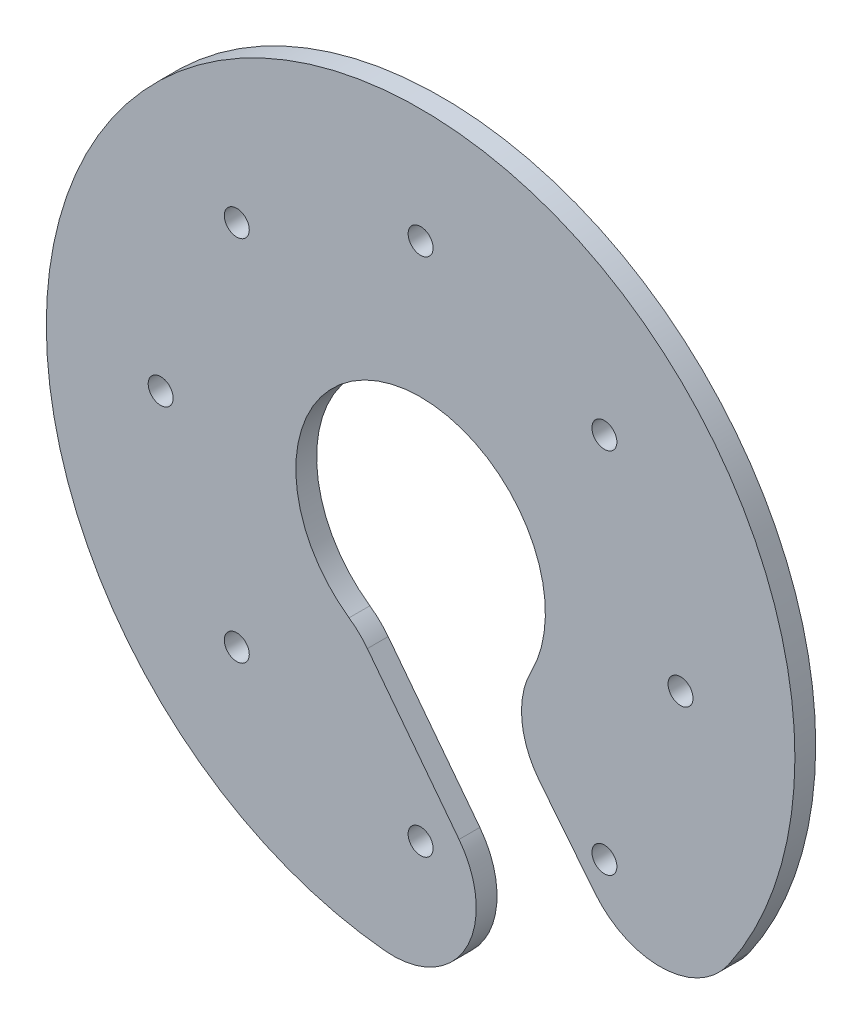
ISO-10303-21;
HEADER;
FILE_DESCRIPTION(('STEP AP214'),'2;1');
FILE_NAME('part.step','',(''),(''),'','','');
FILE_SCHEMA(('AUTOMOTIVE_DESIGN { 1 0 10303 214 1 1 1 1 }'));
ENDSEC;
DATA;
#1=APPLICATION_CONTEXT('core data for automotive mechanical design processes');
#2=APPLICATION_PROTOCOL_DEFINITION('international standard','automotive_design',2000,#1);
#3=PRODUCT_CONTEXT('',#1,'mechanical');
#4=PRODUCT('Part','Part','',(#3));
#5=PRODUCT_RELATED_PRODUCT_CATEGORY('part','',(#4));
#6=PRODUCT_DEFINITION_FORMATION('','',#4);
#7=PRODUCT_DEFINITION_CONTEXT('part definition',#1,'design');
#8=PRODUCT_DEFINITION('design','',#6,#7);
#9=PRODUCT_DEFINITION_SHAPE('','',#8);
#10=(LENGTH_UNIT() NAMED_UNIT(*) SI_UNIT(.MILLI.,.METRE.));
#11=(NAMED_UNIT(*) PLANE_ANGLE_UNIT() SI_UNIT($,.RADIAN.));
#12=(NAMED_UNIT(*) SI_UNIT($,.STERADIAN.) SOLID_ANGLE_UNIT());
#13=UNCERTAINTY_MEASURE_WITH_UNIT(LENGTH_MEASURE(1.E-05),#10,'distance_accuracy_value','');
#14=(GEOMETRIC_REPRESENTATION_CONTEXT(3) GLOBAL_UNCERTAINTY_ASSIGNED_CONTEXT((#13)) GLOBAL_UNIT_ASSIGNED_CONTEXT((#10,
#11,#12)) REPRESENTATION_CONTEXT('',''));
#15=CARTESIAN_POINT('',(0.,0.,0.));
#16=DIRECTION('',(0.,0.,1.));
#17=DIRECTION('',(1.,0.,0.));
#18=AXIS2_PLACEMENT_3D('',#15,#16,#17);
#19=CARTESIAN_POINT('',(0.,0.,5.));
#20=DIRECTION('',(0.,0.,-1.));
#21=DIRECTION('',(-1.,0.,0.));
#22=AXIS2_PLACEMENT_3D('',#19,#20,#21);
#23=CYLINDRICAL_SURFACE('',#22,90.);
#24=CARTESIAN_POINT('',(0.,0.,0.));
#25=DIRECTION('',(0.,0.,1.));
#26=DIRECTION('',(1.,0.,0.));
#27=AXIS2_PLACEMENT_3D('',#24,#25,#26);
#28=CIRCLE('',#27,90.);
#29=CARTESIAN_POINT('',(73.9953490326579,-51.2317120691387,0.));
#30=VERTEX_POINT('',#29);
#31=CARTESIAN_POINT('',(-8.50955709755238,-89.5968048426031,0.));
#32=VERTEX_POINT('',#31);
#33=EDGE_CURVE('E155',#30,#32,#28,.T.);
#34=ORIENTED_EDGE('',*,*,#33,.T.);
#35=DIRECTION('',(0.,0.,-1.));
#36=VECTOR('',#35,1.);
#37=CARTESIAN_POINT('',(-8.50955709755238,-89.5968048426031,5.));
#38=LINE('',#37,#36);
#39=CARTESIAN_POINT('',(-8.50955709755238,-89.5968048426031,5.));
#40=VERTEX_POINT('',#39);
#41=EDGE_CURVE('E147',#32,#40,#38,.F.);
#42=ORIENTED_EDGE('',*,*,#41,.T.);
#43=CARTESIAN_POINT('',(0.,0.,5.));
#44=DIRECTION('',(0.,0.,1.));
#45=DIRECTION('',(1.,0.,0.));
#46=AXIS2_PLACEMENT_3D('',#43,#44,#45);
#47=CIRCLE('',#46,90.);
#48=CARTESIAN_POINT('',(73.9953490326579,-51.2317120691387,5.));
#49=VERTEX_POINT('',#48);
#50=EDGE_CURVE('E120',#49,#40,#47,.T.);
#51=ORIENTED_EDGE('',*,*,#50,.F.);
#52=DIRECTION('',(0.,0.,-1.));
#53=VECTOR('',#52,1.);
#54=CARTESIAN_POINT('',(73.9953490326579,-51.2317120691387,5.));
#55=LINE('',#54,#53);
#56=EDGE_CURVE('E109',#49,#30,#55,.T.);
#57=ORIENTED_EDGE('',*,*,#56,.T.);
#58=EDGE_LOOP('',(#34,#42,#51,#57));
#59=FACE_BOUND('',#58,.T.);
#60=ADVANCED_FACE('F35',(#59),#23,.T.);
#61=CARTESIAN_POINT('',(0.,0.,5.));
#62=DIRECTION('',(0.,0.,1.));
#63=DIRECTION('',(1.,0.,0.));
#64=AXIS2_PLACEMENT_3D('',#61,#62,#63);
#65=PLANE('',#64);
#66=CARTESIAN_POINT('',(44.1941738241591,-44.1941738241593,5.));
#67=DIRECTION('',(0.,0.,1.));
#68=DIRECTION('',(1.,0.,0.));
#69=AXIS2_PLACEMENT_3D('',#66,#67,#68);
#70=CIRCLE('',#69,3.);
#71=CARTESIAN_POINT('',(47.1941738241591,-44.1941738241593,5.));
#72=VERTEX_POINT('',#71);
#73=EDGE_CURVE('E178',#72,#72,#70,.T.);
#74=ORIENTED_EDGE('',*,*,#73,.F.);
#75=EDGE_LOOP('',(#74));
#76=FACE_BOUND('',#75,.T.);
#77=CARTESIAN_POINT('',(-2.18217583677696E-13,-62.5,5.));
#78=DIRECTION('',(0.,0.,1.));
#79=DIRECTION('',(1.,0.,0.));
#80=AXIS2_PLACEMENT_3D('',#77,#78,#79);
#81=CIRCLE('',#80,2.99999999999999);
#82=CARTESIAN_POINT('',(2.99999999999977,-62.5,5.));
#83=VERTEX_POINT('',#82);
#84=EDGE_CURVE('E397',#83,#83,#81,.T.);
#85=ORIENTED_EDGE('',*,*,#84,.F.);
#86=EDGE_LOOP('',(#85));
#87=FACE_BOUND('',#86,.T.);
#88=CARTESIAN_POINT('',(-44.1941738241594,-44.194173824159,5.));
#89=DIRECTION('',(0.,0.,1.));
#90=DIRECTION('',(1.,0.,0.));
#91=AXIS2_PLACEMENT_3D('',#88,#89,#90);
#92=CIRCLE('',#91,2.99999999999999);
#93=CARTESIAN_POINT('',(-41.1941738241594,-44.194173824159,5.));
#94=VERTEX_POINT('',#93);
#95=EDGE_CURVE('E394',#94,#94,#92,.T.);
#96=ORIENTED_EDGE('',*,*,#95,.F.);
#97=EDGE_LOOP('',(#96));
#98=FACE_BOUND('',#97,.T.);
#99=CARTESIAN_POINT('',(-62.5,4.36435167355392E-13,5.));
#100=DIRECTION('',(0.,0.,1.));
#101=DIRECTION('',(1.,0.,0.));
#102=AXIS2_PLACEMENT_3D('',#99,#100,#101);
#103=CIRCLE('',#102,2.99999999999999);
#104=CARTESIAN_POINT('',(-59.5,4.36435167355392E-13,5.));
#105=VERTEX_POINT('',#104);
#106=EDGE_CURVE('E389',#105,#105,#103,.T.);
#107=ORIENTED_EDGE('',*,*,#106,.F.);
#108=EDGE_LOOP('',(#107));
#109=FACE_BOUND('',#108,.T.);
#110=CARTESIAN_POINT('',(-44.1941738241588,44.1941738241596,5.));
#111=DIRECTION('',(0.,0.,1.));
#112=DIRECTION('',(1.,0.,0.));
#113=AXIS2_PLACEMENT_3D('',#110,#111,#112);
#114=CIRCLE('',#113,3.);
#115=CARTESIAN_POINT('',(-41.1941738241588,44.1941738241596,5.));
#116=VERTEX_POINT('',#115);
#117=EDGE_CURVE('E386',#116,#116,#114,.T.);
#118=ORIENTED_EDGE('',*,*,#117,.F.);
#119=EDGE_LOOP('',(#118));
#120=FACE_BOUND('',#119,.T.);
#121=CARTESIAN_POINT('',(6.54652751033088E-13,62.5,5.));
#122=DIRECTION('',(0.,0.,1.));
#123=DIRECTION('',(1.,0.,0.));
#124=AXIS2_PLACEMENT_3D('',#121,#122,#123);
#125=CIRCLE('',#124,2.99999999999999);
#126=CARTESIAN_POINT('',(3.00000000000065,62.5,5.));
#127=VERTEX_POINT('',#126);
#128=EDGE_CURVE('E384',#127,#127,#125,.T.);
#129=ORIENTED_EDGE('',*,*,#128,.F.);
#130=EDGE_LOOP('',(#129));
#131=FACE_BOUND('',#130,.T.);
#132=CARTESIAN_POINT('',(44.1941738241597,44.1941738241587,5.));
#133=DIRECTION('',(0.,0.,1.));
#134=DIRECTION('',(1.,0.,0.));
#135=AXIS2_PLACEMENT_3D('',#132,#133,#134);
#136=CIRCLE('',#135,2.99999999999999);
#137=CARTESIAN_POINT('',(47.1941738241597,44.1941738241587,5.));
#138=VERTEX_POINT('',#137);
#139=EDGE_CURVE('E202',#138,#138,#136,.T.);
#140=ORIENTED_EDGE('',*,*,#139,.F.);
#141=EDGE_LOOP('',(#140));
#142=FACE_BOUND('',#141,.T.);
#143=CARTESIAN_POINT('',(62.5,0.,5.));
#144=DIRECTION('',(0.,0.,1.));
#145=DIRECTION('',(1.,0.,0.));
#146=AXIS2_PLACEMENT_3D('',#143,#144,#145);
#147=CIRCLE('',#146,2.99999999999999);
#148=CARTESIAN_POINT('',(65.5,0.,5.));
#149=VERTEX_POINT('',#148);
#150=EDGE_CURVE('E173',#149,#149,#147,.T.);
#151=ORIENTED_EDGE('',*,*,#150,.F.);
#152=EDGE_LOOP('',(#151));
#153=FACE_BOUND('',#152,.T.);
#154=DIRECTION('',(0.608922434801944,-0.793229770239917,0.));
#155=VECTOR('',#154,1.);
#156=CARTESIAN_POINT('',(-14.9208081048509,-26.0263229346409,5.));
#157=LINE('',#156,#155);
#158=CARTESIAN_POINT('',(-12.7999028265818,-28.789179269749,5.));
#159=VERTEX_POINT('',#158);
#160=CARTESIAN_POINT('',(9.24605099559094,-57.5079550704302,5.));
#161=VERTEX_POINT('',#160);
#162=EDGE_CURVE('E205',#159,#161,#157,.T.);
#163=ORIENTED_EDGE('',*,*,#162,.F.);
#164=CARTESIAN_POINT('',(-28.6644982313802,-40.9676279657878,5.));
#165=DIRECTION('',(0.,0.,1.));
#166=DIRECTION('',(1.,0.,0.));
#167=AXIS2_PLACEMENT_3D('',#164,#165,#166);
#168=CIRCLE('',#167,20.);
#169=CARTESIAN_POINT('',(-17.1986989388281,-24.5805767794727,5.));
#170=VERTEX_POINT('',#169);
#171=EDGE_CURVE('E123',#159,#170,#168,.T.);
#172=ORIENTED_EDGE('',*,*,#171,.T.);
#173=CARTESIAN_POINT('',(0.,0.,5.));
#174=DIRECTION('',(0.,0.,1.));
#175=DIRECTION('',(1.,0.,0.));
#176=AXIS2_PLACEMENT_3D('',#173,#174,#175);
#177=CIRCLE('',#176,30.);
#178=CARTESIAN_POINT('',(26.5567679917836,-13.9548584310475,5.));
#179=VERTEX_POINT('',#178);
#180=EDGE_CURVE('E172',#179,#170,#177,.T.);
#181=ORIENTED_EDGE('',*,*,#180,.F.);
#182=CARTESIAN_POINT('',(44.261279986306,-23.2580973850792,5.));
#183=DIRECTION('',(0.,0.,1.));
#184=DIRECTION('',(1.,0.,0.));
#185=AXIS2_PLACEMENT_3D('',#182,#183,#184);
#186=CIRCLE('',#185,20.);
#187=CARTESIAN_POINT('',(28.6529158454746,-35.763255074897,5.));
#188=VERTEX_POINT('',#187);
#189=EDGE_CURVE('E124',#179,#188,#186,.T.);
#190=ORIENTED_EDGE('',*,*,#189,.T.);
#191=DIRECTION('',(-0.625257884490891,0.780418207041568,0.));
#192=VECTOR('',#191,1.);
#193=CARTESIAN_POINT('',(69.7683284825411,-87.0816269145744,5.));
#194=LINE('',#193,#192);
#195=CARTESIAN_POINT('',(41.9435739956803,-52.3520448547035,5.));
#196=VERTEX_POINT('',#195);
#197=EDGE_CURVE('E162',#196,#188,#194,.T.);
#198=ORIENTED_EDGE('',*,*,#197,.F.);
#199=CARTESIAN_POINT('',(57.5519381365117,-39.8468871648857,5.));
#200=DIRECTION('',(0.,0.,1.));
#201=DIRECTION('',(1.,0.,0.));
#202=AXIS2_PLACEMENT_3D('',#199,#200,#201);
#203=CIRCLE('',#202,20.);
#204=EDGE_CURVE('E126',#196,#49,#203,.T.);
#205=ORIENTED_EDGE('',*,*,#204,.T.);
#206=ORIENTED_EDGE('',*,*,#50,.T.);
#207=CARTESIAN_POINT('',(-6.61854440920741,-69.686403766469,5.));
#208=DIRECTION('',(0.,0.,1.));
#209=DIRECTION('',(1.,0.,0.));
#210=AXIS2_PLACEMENT_3D('',#207,#208,#209);
#211=CIRCLE('',#210,20.);
#212=EDGE_CURVE('E133',#40,#161,#211,.T.);
#213=ORIENTED_EDGE('',*,*,#212,.T.);
#214=EDGE_LOOP('',(#163,#172,#181,#190,#198,#205,#206,#213));
#215=FACE_BOUND('',#214,.T.);
#216=ADVANCED_FACE('F158',(#76,#87,#98,#109,#120,#131,#142,#153,#215),#65,.T.);
#217=CARTESIAN_POINT('',(0.,0.,0.));
#218=DIRECTION('',(0.,0.,1.));
#219=DIRECTION('',(1.,0.,0.));
#220=AXIS2_PLACEMENT_3D('',#217,#218,#219);
#221=PLANE('',#220);
#222=CARTESIAN_POINT('',(44.1941738241591,-44.1941738241593,0.));
#223=DIRECTION('',(0.,0.,1.));
#224=DIRECTION('',(1.,0.,0.));
#225=AXIS2_PLACEMENT_3D('',#222,#223,#224);
#226=CIRCLE('',#225,3.);
#227=CARTESIAN_POINT('',(47.1941738241591,-44.1941738241593,0.));
#228=VERTEX_POINT('',#227);
#229=EDGE_CURVE('E192',#228,#228,#226,.T.);
#230=ORIENTED_EDGE('',*,*,#229,.T.);
#231=EDGE_LOOP('',(#230));
#232=FACE_BOUND('',#231,.T.);
#233=CARTESIAN_POINT('',(-2.18217583677696E-13,-62.5,0.));
#234=DIRECTION('',(0.,0.,1.));
#235=DIRECTION('',(1.,0.,0.));
#236=AXIS2_PLACEMENT_3D('',#233,#234,#235);
#237=CIRCLE('',#236,2.99999999999999);
#238=CARTESIAN_POINT('',(2.99999999999977,-62.5,0.));
#239=VERTEX_POINT('',#238);
#240=EDGE_CURVE('E190',#239,#239,#237,.T.);
#241=ORIENTED_EDGE('',*,*,#240,.T.);
#242=EDGE_LOOP('',(#241));
#243=FACE_BOUND('',#242,.T.);
#244=CARTESIAN_POINT('',(-44.1941738241594,-44.194173824159,0.));
#245=DIRECTION('',(0.,0.,1.));
#246=DIRECTION('',(1.,0.,0.));
#247=AXIS2_PLACEMENT_3D('',#244,#245,#246);
#248=CIRCLE('',#247,2.99999999999999);
#249=CARTESIAN_POINT('',(-41.1941738241594,-44.194173824159,0.));
#250=VERTEX_POINT('',#249);
#251=EDGE_CURVE('E187',#250,#250,#248,.T.);
#252=ORIENTED_EDGE('',*,*,#251,.T.);
#253=EDGE_LOOP('',(#252));
#254=FACE_BOUND('',#253,.T.);
#255=CARTESIAN_POINT('',(-62.5,4.36435167355392E-13,0.));
#256=DIRECTION('',(0.,0.,1.));
#257=DIRECTION('',(1.,0.,0.));
#258=AXIS2_PLACEMENT_3D('',#255,#256,#257);
#259=CIRCLE('',#258,2.99999999999999);
#260=CARTESIAN_POINT('',(-59.5,4.36435167355392E-13,0.));
#261=VERTEX_POINT('',#260);
#262=EDGE_CURVE('E184',#261,#261,#259,.T.);
#263=ORIENTED_EDGE('',*,*,#262,.T.);
#264=EDGE_LOOP('',(#263));
#265=FACE_BOUND('',#264,.T.);
#266=CARTESIAN_POINT('',(-44.1941738241588,44.1941738241596,0.));
#267=DIRECTION('',(0.,0.,1.));
#268=DIRECTION('',(1.,0.,0.));
#269=AXIS2_PLACEMENT_3D('',#266,#267,#268);
#270=CIRCLE('',#269,3.);
#271=CARTESIAN_POINT('',(-41.1941738241588,44.1941738241596,0.));
#272=VERTEX_POINT('',#271);
#273=EDGE_CURVE('E181',#272,#272,#270,.T.);
#274=ORIENTED_EDGE('',*,*,#273,.T.);
#275=EDGE_LOOP('',(#274));
#276=FACE_BOUND('',#275,.T.);
#277=CARTESIAN_POINT('',(6.54652751033088E-13,62.5,0.));
#278=DIRECTION('',(0.,0.,1.));
#279=DIRECTION('',(1.,0.,0.));
#280=AXIS2_PLACEMENT_3D('',#277,#278,#279);
#281=CIRCLE('',#280,2.99999999999999);
#282=CARTESIAN_POINT('',(3.00000000000065,62.5,0.));
#283=VERTEX_POINT('',#282);
#284=EDGE_CURVE('E177',#283,#283,#281,.T.);
#285=ORIENTED_EDGE('',*,*,#284,.T.);
#286=EDGE_LOOP('',(#285));
#287=FACE_BOUND('',#286,.T.);
#288=CARTESIAN_POINT('',(44.1941738241597,44.1941738241587,0.));
#289=DIRECTION('',(0.,0.,1.));
#290=DIRECTION('',(1.,0.,0.));
#291=AXIS2_PLACEMENT_3D('',#288,#289,#290);
#292=CIRCLE('',#291,2.99999999999999);
#293=CARTESIAN_POINT('',(47.1941738241597,44.1941738241587,0.));
#294=VERTEX_POINT('',#293);
#295=EDGE_CURVE('E174',#294,#294,#292,.T.);
#296=ORIENTED_EDGE('',*,*,#295,.T.);
#297=EDGE_LOOP('',(#296));
#298=FACE_BOUND('',#297,.T.);
#299=CARTESIAN_POINT('',(62.5,0.,0.));
#300=DIRECTION('',(0.,0.,1.));
#301=DIRECTION('',(1.,0.,0.));
#302=AXIS2_PLACEMENT_3D('',#299,#300,#301);
#303=CIRCLE('',#302,2.99999999999999);
#304=CARTESIAN_POINT('',(65.5,0.,0.));
#305=VERTEX_POINT('',#304);
#306=EDGE_CURVE('E169',#305,#305,#303,.T.);
#307=ORIENTED_EDGE('',*,*,#306,.T.);
#308=EDGE_LOOP('',(#307));
#309=FACE_BOUND('',#308,.T.);
#310=CARTESIAN_POINT('',(0.,0.,0.));
#311=DIRECTION('',(0.,0.,1.));
#312=DIRECTION('',(1.,0.,0.));
#313=AXIS2_PLACEMENT_3D('',#310,#311,#312);
#314=CIRCLE('',#313,30.);
#315=CARTESIAN_POINT('',(26.5567679917836,-13.9548584310475,0.));
#316=VERTEX_POINT('',#315);
#317=CARTESIAN_POINT('',(-17.1986989388281,-24.5805767794727,0.));
#318=VERTEX_POINT('',#317);
#319=EDGE_CURVE('E105',#316,#318,#314,.T.);
#320=ORIENTED_EDGE('',*,*,#319,.T.);
#321=CARTESIAN_POINT('',(-28.6644982313802,-40.9676279657878,0.));
#322=DIRECTION('',(0.,0.,1.));
#323=DIRECTION('',(1.,0.,0.));
#324=AXIS2_PLACEMENT_3D('',#321,#322,#323);
#325=CIRCLE('',#324,20.);
#326=CARTESIAN_POINT('',(-12.7999028265818,-28.789179269749,0.));
#327=VERTEX_POINT('',#326);
#328=EDGE_CURVE('E99',#318,#327,#325,.F.);
#329=ORIENTED_EDGE('',*,*,#328,.T.);
#330=DIRECTION('',(0.608922434801944,-0.793229770239917,0.));
#331=VECTOR('',#330,1.);
#332=CARTESIAN_POINT('',(-21.9594882811414,-16.8571901519948,0.));
#333=LINE('',#332,#331);
#334=CARTESIAN_POINT('',(9.24605099559093,-57.5079550704302,0.));
#335=VERTEX_POINT('',#334);
#336=EDGE_CURVE('E102',#327,#335,#333,.T.);
#337=ORIENTED_EDGE('',*,*,#336,.T.);
#338=CARTESIAN_POINT('',(-6.61854440920741,-69.686403766469,0.));
#339=DIRECTION('',(0.,0.,1.));
#340=DIRECTION('',(1.,0.,0.));
#341=AXIS2_PLACEMENT_3D('',#338,#339,#340);
#342=CIRCLE('',#341,20.);
#343=EDGE_CURVE('E110',#335,#32,#342,.F.);
#344=ORIENTED_EDGE('',*,*,#343,.T.);
#345=ORIENTED_EDGE('',*,*,#33,.F.);
#346=CARTESIAN_POINT('',(57.5519381365117,-39.8468871648857,0.));
#347=DIRECTION('',(0.,0.,1.));
#348=DIRECTION('',(1.,0.,0.));
#349=AXIS2_PLACEMENT_3D('',#346,#347,#348);
#350=CIRCLE('',#349,20.);
#351=CARTESIAN_POINT('',(41.9435739956803,-52.3520448547035,0.));
#352=VERTEX_POINT('',#351);
#353=EDGE_CURVE('E56',#30,#352,#350,.F.);
#354=ORIENTED_EDGE('',*,*,#353,.T.);
#355=DIRECTION('',(-0.625257884490891,0.780418207041568,0.));
#356=VECTOR('',#355,1.);
#357=CARTESIAN_POINT('',(0.,0.,0.));
#358=LINE('',#357,#356);
#359=CARTESIAN_POINT('',(28.6529158454747,-35.763255074897,0.));
#360=VERTEX_POINT('',#359);
#361=EDGE_CURVE('E128',#352,#360,#358,.T.);
#362=ORIENTED_EDGE('',*,*,#361,.T.);
#363=CARTESIAN_POINT('',(44.261279986306,-23.2580973850792,0.));
#364=DIRECTION('',(0.,0.,1.));
#365=DIRECTION('',(1.,0.,0.));
#366=AXIS2_PLACEMENT_3D('',#363,#364,#365);
#367=CIRCLE('',#366,20.);
#368=EDGE_CURVE('E141',#360,#316,#367,.F.);
#369=ORIENTED_EDGE('',*,*,#368,.T.);
#370=EDGE_LOOP('',(#320,#329,#337,#344,#345,#354,#362,#369));
#371=FACE_BOUND('',#370,.T.);
#372=ADVANCED_FACE('F101',(#232,#243,#254,#265,#276,#287,#298,#309,#371),#221,.F.);
#373=CARTESIAN_POINT('',(0.,0.,-39.));
#374=DIRECTION('',(0.,0.,1.));
#375=DIRECTION('',(1.,0.,0.));
#376=AXIS2_PLACEMENT_3D('',#373,#374,#375);
#377=CYLINDRICAL_SURFACE('',#376,30.);
#378=ORIENTED_EDGE('',*,*,#180,.T.);
#379=DIRECTION('',(0.,0.,1.));
#380=VECTOR('',#379,1.);
#381=CARTESIAN_POINT('',(-17.1986989388281,-24.5805767794727,-39.));
#382=LINE('',#381,#380);
#383=EDGE_CURVE('E139',#170,#318,#382,.F.);
#384=ORIENTED_EDGE('',*,*,#383,.T.);
#385=ORIENTED_EDGE('',*,*,#319,.F.);
#386=DIRECTION('',(0.,0.,1.));
#387=VECTOR('',#386,1.);
#388=CARTESIAN_POINT('',(26.5567679917836,-13.9548584310475,-39.));
#389=LINE('',#388,#387);
#390=EDGE_CURVE('E136',#316,#179,#389,.T.);
#391=ORIENTED_EDGE('',*,*,#390,.T.);
#392=EDGE_LOOP('',(#378,#384,#385,#391));
#393=FACE_BOUND('',#392,.T.);
#394=ADVANCED_FACE('F212',(#393),#377,.F.);
#395=CARTESIAN_POINT('',(69.7683284825411,-87.0816269145744,-39.));
#396=DIRECTION('',(0.780418207041568,0.625257884490891,0.));
#397=DIRECTION('',(-0.625257884490891,0.780418207041568,0.));
#398=AXIS2_PLACEMENT_3D('',#395,#396,#397);
#399=PLANE('',#398);
#400=ORIENTED_EDGE('',*,*,#361,.F.);
#401=DIRECTION('',(0.,0.,-1.));
#402=VECTOR('',#401,1.);
#403=CARTESIAN_POINT('',(41.9435739956803,-52.3520448547035,-39.));
#404=LINE('',#403,#402);
#405=EDGE_CURVE('E11',#352,#196,#404,.F.);
#406=ORIENTED_EDGE('',*,*,#405,.T.);
#407=ORIENTED_EDGE('',*,*,#197,.T.);
#408=DIRECTION('',(0.,0.,1.));
#409=VECTOR('',#408,1.);
#410=CARTESIAN_POINT('',(28.6529158454746,-35.763255074897,-39.));
#411=LINE('',#410,#409);
#412=EDGE_CURVE('E43',#188,#360,#411,.F.);
#413=ORIENTED_EDGE('',*,*,#412,.T.);
#414=EDGE_LOOP('',(#400,#406,#407,#413));
#415=FACE_BOUND('',#414,.T.);
#416=ADVANCED_FACE('F206',(#415),#399,.F.);
#417=CARTESIAN_POINT('',(-14.9208081048509,-26.0263229346409,-39.));
#418=DIRECTION('',(-0.793229770239917,-0.608922434801944,0.));
#419=DIRECTION('',(0.608922434801944,-0.793229770239917,0.));
#420=AXIS2_PLACEMENT_3D('',#417,#418,#419);
#421=PLANE('',#420);
#422=ORIENTED_EDGE('',*,*,#336,.F.);
#423=DIRECTION('',(0.,0.,1.));
#424=VECTOR('',#423,1.);
#425=CARTESIAN_POINT('',(-12.7999028265818,-28.789179269749,-39.));
#426=LINE('',#425,#424);
#427=EDGE_CURVE('E116',#327,#159,#426,.T.);
#428=ORIENTED_EDGE('',*,*,#427,.T.);
#429=ORIENTED_EDGE('',*,*,#162,.T.);
#430=DIRECTION('',(0.,0.,-1.));
#431=VECTOR('',#430,1.);
#432=CARTESIAN_POINT('',(9.24605099559093,-57.5079550704302,-39.));
#433=LINE('',#432,#431);
#434=EDGE_CURVE('E119',#161,#335,#433,.T.);
#435=ORIENTED_EDGE('',*,*,#434,.T.);
#436=EDGE_LOOP('',(#422,#428,#429,#435));
#437=FACE_BOUND('',#436,.T.);
#438=ADVANCED_FACE('F114',(#437),#421,.F.);
#439=CARTESIAN_POINT('',(62.5,0.,-124.));
#440=DIRECTION('',(0.,0.,1.));
#441=DIRECTION('',(1.,0.,0.));
#442=AXIS2_PLACEMENT_3D('',#439,#440,#441);
#443=CYLINDRICAL_SURFACE('',#442,2.99999999999999);
#444=ORIENTED_EDGE('',*,*,#150,.T.);
#445=EDGE_LOOP('',(#444));
#446=FACE_BOUND('',#445,.T.);
#447=ORIENTED_EDGE('',*,*,#306,.F.);
#448=EDGE_LOOP('',(#447));
#449=FACE_BOUND('',#448,.T.);
#450=ADVANCED_FACE('F271',(#446,#449),#443,.F.);
#451=CARTESIAN_POINT('',(44.1941738241597,44.1941738241587,-124.));
#452=DIRECTION('',(0.,0.,1.));
#453=DIRECTION('',(1.,0.,0.));
#454=AXIS2_PLACEMENT_3D('',#451,#452,#453);
#455=CYLINDRICAL_SURFACE('',#454,2.99999999999999);
#456=ORIENTED_EDGE('',*,*,#139,.T.);
#457=EDGE_LOOP('',(#456));
#458=FACE_BOUND('',#457,.T.);
#459=ORIENTED_EDGE('',*,*,#295,.F.);
#460=EDGE_LOOP('',(#459));
#461=FACE_BOUND('',#460,.T.);
#462=ADVANCED_FACE('F355',(#458,#461),#455,.F.);
#463=CARTESIAN_POINT('',(6.54652751033088E-13,62.5,-124.));
#464=DIRECTION('',(0.,0.,1.));
#465=DIRECTION('',(1.,0.,0.));
#466=AXIS2_PLACEMENT_3D('',#463,#464,#465);
#467=CYLINDRICAL_SURFACE('',#466,2.99999999999999);
#468=ORIENTED_EDGE('',*,*,#128,.T.);
#469=EDGE_LOOP('',(#468));
#470=FACE_BOUND('',#469,.T.);
#471=ORIENTED_EDGE('',*,*,#284,.F.);
#472=EDGE_LOOP('',(#471));
#473=FACE_BOUND('',#472,.T.);
#474=ADVANCED_FACE('F345',(#470,#473),#467,.F.);
#475=CARTESIAN_POINT('',(-44.1941738241588,44.1941738241596,-124.));
#476=DIRECTION('',(0.,0.,1.));
#477=DIRECTION('',(1.,0.,0.));
#478=AXIS2_PLACEMENT_3D('',#475,#476,#477);
#479=CYLINDRICAL_SURFACE('',#478,3.);
#480=ORIENTED_EDGE('',*,*,#117,.T.);
#481=EDGE_LOOP('',(#480));
#482=FACE_BOUND('',#481,.T.);
#483=ORIENTED_EDGE('',*,*,#273,.F.);
#484=EDGE_LOOP('',(#483));
#485=FACE_BOUND('',#484,.T.);
#486=ADVANCED_FACE('F335',(#482,#485),#479,.F.);
#487=CARTESIAN_POINT('',(-62.5,4.36435167355392E-13,-124.));
#488=DIRECTION('',(0.,0.,1.));
#489=DIRECTION('',(1.,0.,0.));
#490=AXIS2_PLACEMENT_3D('',#487,#488,#489);
#491=CYLINDRICAL_SURFACE('',#490,2.99999999999999);
#492=ORIENTED_EDGE('',*,*,#106,.T.);
#493=EDGE_LOOP('',(#492));
#494=FACE_BOUND('',#493,.T.);
#495=ORIENTED_EDGE('',*,*,#262,.F.);
#496=EDGE_LOOP('',(#495));
#497=FACE_BOUND('',#496,.T.);
#498=ADVANCED_FACE('F325',(#494,#497),#491,.F.);
#499=CARTESIAN_POINT('',(-44.1941738241594,-44.194173824159,-124.));
#500=DIRECTION('',(0.,0.,1.));
#501=DIRECTION('',(1.,0.,0.));
#502=AXIS2_PLACEMENT_3D('',#499,#500,#501);
#503=CYLINDRICAL_SURFACE('',#502,2.99999999999999);
#504=ORIENTED_EDGE('',*,*,#95,.T.);
#505=EDGE_LOOP('',(#504));
#506=FACE_BOUND('',#505,.T.);
#507=ORIENTED_EDGE('',*,*,#251,.F.);
#508=EDGE_LOOP('',(#507));
#509=FACE_BOUND('',#508,.T.);
#510=ADVANCED_FACE('F315',(#506,#509),#503,.F.);
#511=CARTESIAN_POINT('',(-2.18217583677696E-13,-62.5,-124.));
#512=DIRECTION('',(0.,0.,1.));
#513=DIRECTION('',(1.,0.,0.));
#514=AXIS2_PLACEMENT_3D('',#511,#512,#513);
#515=CYLINDRICAL_SURFACE('',#514,2.99999999999999);
#516=ORIENTED_EDGE('',*,*,#84,.T.);
#517=EDGE_LOOP('',(#516));
#518=FACE_BOUND('',#517,.T.);
#519=ORIENTED_EDGE('',*,*,#240,.F.);
#520=EDGE_LOOP('',(#519));
#521=FACE_BOUND('',#520,.T.);
#522=ADVANCED_FACE('F305',(#518,#521),#515,.F.);
#523=CARTESIAN_POINT('',(44.1941738241591,-44.1941738241593,-124.));
#524=DIRECTION('',(0.,0.,1.));
#525=DIRECTION('',(1.,0.,0.));
#526=AXIS2_PLACEMENT_3D('',#523,#524,#525);
#527=CYLINDRICAL_SURFACE('',#526,3.);
#528=ORIENTED_EDGE('',*,*,#73,.T.);
#529=EDGE_LOOP('',(#528));
#530=FACE_BOUND('',#529,.T.);
#531=ORIENTED_EDGE('',*,*,#229,.F.);
#532=EDGE_LOOP('',(#531));
#533=FACE_BOUND('',#532,.T.);
#534=ADVANCED_FACE('F234',(#530,#533),#527,.F.);
#535=CARTESIAN_POINT('',(-28.6644982313802,-40.9676279657878,-39.));
#536=DIRECTION('',(0.,0.,1.));
#537=DIRECTION('',(1.,0.,0.));
#538=AXIS2_PLACEMENT_3D('',#535,#536,#537);
#539=CYLINDRICAL_SURFACE('',#538,20.);
#540=ORIENTED_EDGE('',*,*,#328,.F.);
#541=ORIENTED_EDGE('',*,*,#383,.F.);
#542=ORIENTED_EDGE('',*,*,#171,.F.);
#543=ORIENTED_EDGE('',*,*,#427,.F.);
#544=EDGE_LOOP('',(#540,#541,#542,#543));
#545=FACE_BOUND('',#544,.T.);
#546=ADVANCED_FACE('F122',(#545),#539,.T.);
#547=CARTESIAN_POINT('',(-6.61854440920741,-69.686403766469,5.));
#548=DIRECTION('',(0.,0.,-1.));
#549=DIRECTION('',(-1.,0.,0.));
#550=AXIS2_PLACEMENT_3D('',#547,#548,#549);
#551=CYLINDRICAL_SURFACE('',#550,20.);
#552=ORIENTED_EDGE('',*,*,#343,.F.);
#553=ORIENTED_EDGE('',*,*,#434,.F.);
#554=ORIENTED_EDGE('',*,*,#212,.F.);
#555=ORIENTED_EDGE('',*,*,#41,.F.);
#556=EDGE_LOOP('',(#552,#553,#554,#555));
#557=FACE_BOUND('',#556,.T.);
#558=ADVANCED_FACE('F233',(#557),#551,.T.);
#559=CARTESIAN_POINT('',(57.5519381365117,-39.8468871648857,5.));
#560=DIRECTION('',(0.,0.,-1.));
#561=DIRECTION('',(-1.,0.,0.));
#562=AXIS2_PLACEMENT_3D('',#559,#560,#561);
#563=CYLINDRICAL_SURFACE('',#562,20.);
#564=ORIENTED_EDGE('',*,*,#204,.F.);
#565=ORIENTED_EDGE('',*,*,#405,.F.);
#566=ORIENTED_EDGE('',*,*,#353,.F.);
#567=ORIENTED_EDGE('',*,*,#56,.F.);
#568=EDGE_LOOP('',(#564,#565,#566,#567));
#569=FACE_BOUND('',#568,.T.);
#570=ADVANCED_FACE('F236',(#569),#563,.T.);
#571=CARTESIAN_POINT('',(44.261279986306,-23.2580973850792,-39.));
#572=DIRECTION('',(0.,0.,1.));
#573=DIRECTION('',(1.,0.,0.));
#574=AXIS2_PLACEMENT_3D('',#571,#572,#573);
#575=CYLINDRICAL_SURFACE('',#574,20.);
#576=ORIENTED_EDGE('',*,*,#368,.F.);
#577=ORIENTED_EDGE('',*,*,#412,.F.);
#578=ORIENTED_EDGE('',*,*,#189,.F.);
#579=ORIENTED_EDGE('',*,*,#390,.F.);
#580=EDGE_LOOP('',(#576,#577,#578,#579));
#581=FACE_BOUND('',#580,.T.);
#582=ADVANCED_FACE('F37',(#581),#575,.T.);
#583=CLOSED_SHELL('',(#60,#216,#372,#394,#416,#438,#450,#462,#474,#486,#498,#510,#522,#534,#546,
#558,#570,#582));
#584=MANIFOLD_SOLID_BREP('B2',#583);
#585=ADVANCED_BREP_SHAPE_REPRESENTATION('',(#18,#584),#14);
#586=SHAPE_DEFINITION_REPRESENTATION(#9,#585);
ENDSEC;
END-ISO-10303-21;
